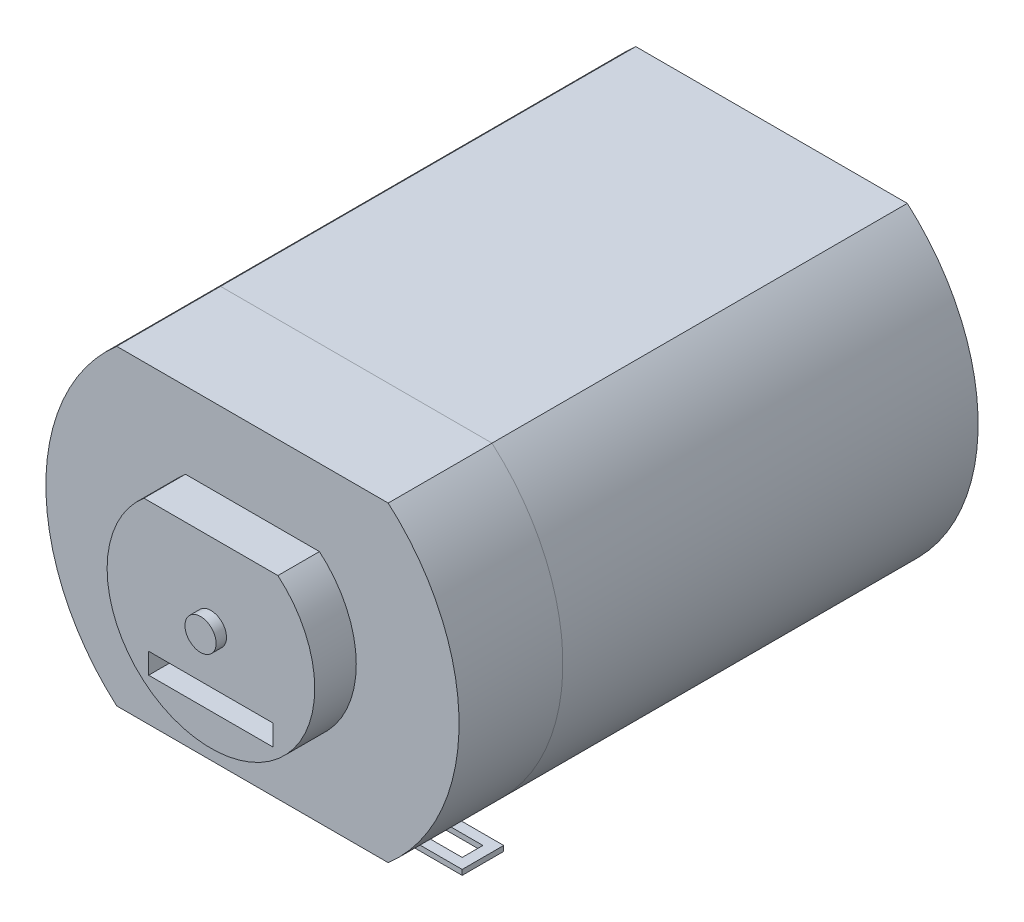
ISO-10303-21;
HEADER;
FILE_DESCRIPTION(('STEP AP214'),'2;1');
FILE_NAME('part.step','',(''),(''),'','','');
FILE_SCHEMA(('AUTOMOTIVE_DESIGN { 1 0 10303 214 1 1 1 1 }'));
ENDSEC;
DATA;
#1=APPLICATION_CONTEXT('core data for automotive mechanical design processes');
#2=APPLICATION_PROTOCOL_DEFINITION('international standard','automotive_design',2000,#1);
#3=PRODUCT_CONTEXT('',#1,'mechanical');
#4=PRODUCT('Part','Part','',(#3));
#5=PRODUCT_RELATED_PRODUCT_CATEGORY('part','',(#4));
#6=PRODUCT_DEFINITION_FORMATION('','',#4);
#7=PRODUCT_DEFINITION_CONTEXT('part definition',#1,'design');
#8=PRODUCT_DEFINITION('design','',#6,#7);
#9=PRODUCT_DEFINITION_SHAPE('','',#8);
#10=(LENGTH_UNIT() NAMED_UNIT(*) SI_UNIT(.MILLI.,.METRE.));
#11=(NAMED_UNIT(*) PLANE_ANGLE_UNIT() SI_UNIT($,.RADIAN.));
#12=(NAMED_UNIT(*) SI_UNIT($,.STERADIAN.) SOLID_ANGLE_UNIT());
#13=UNCERTAINTY_MEASURE_WITH_UNIT(LENGTH_MEASURE(1.E-05),#10,'distance_accuracy_value','');
#14=(GEOMETRIC_REPRESENTATION_CONTEXT(3) GLOBAL_UNCERTAINTY_ASSIGNED_CONTEXT((#13)) GLOBAL_UNIT_ASSIGNED_CONTEXT((#10,
#11,#12)) REPRESENTATION_CONTEXT('',''));
#15=CARTESIAN_POINT('',(0.,0.,0.));
#16=DIRECTION('',(0.,0.,1.));
#17=DIRECTION('',(1.,0.,0.));
#18=AXIS2_PLACEMENT_3D('',#15,#16,#17);
#19=CARTESIAN_POINT('',(0.,-0.77,25.27));
#20=DIRECTION('',(0.,0.,1.));
#21=DIRECTION('',(1.,0.,0.));
#22=AXIS2_PLACEMENT_3D('',#19,#20,#21);
#23=CYLINDRICAL_SURFACE('',#22,9.95);
#24=CARTESIAN_POINT('',(0.,-0.77,25.27));
#25=DIRECTION('',(0.,0.,1.));
#26=DIRECTION('',(1.,0.,0.));
#27=AXIS2_PLACEMENT_3D('',#24,#25,#26);
#28=CIRCLE('',#27,9.95);
#29=CARTESIAN_POINT('',(-6.53853959229429,6.73,25.27));
#30=VERTEX_POINT('',#29);
#31=CARTESIAN_POINT('',(-6.53853959229429,-8.27,25.27));
#32=VERTEX_POINT('',#31);
#33=EDGE_CURVE('P0_E69',#30,#32,#28,.T.);
#34=ORIENTED_EDGE('',*,*,#33,.T.);
#35=DIRECTION('',(0.,0.,1.));
#36=VECTOR('',#35,1.);
#37=CARTESIAN_POINT('',(-6.53853959229429,-8.27,25.27));
#38=LINE('',#37,#36);
#39=CARTESIAN_POINT('',(-6.53853959229429,-8.27,45.27));
#40=VERTEX_POINT('',#39);
#41=EDGE_CURVE('P0_E59',#40,#32,#38,.F.);
#42=ORIENTED_EDGE('',*,*,#41,.F.);
#43=CARTESIAN_POINT('',(0.,-0.77,45.27));
#44=DIRECTION('',(0.,0.,1.));
#45=DIRECTION('',(1.,0.,0.));
#46=AXIS2_PLACEMENT_3D('',#43,#44,#45);
#47=CIRCLE('',#46,9.95);
#48=CARTESIAN_POINT('',(-6.53853959229429,6.73,45.27));
#49=VERTEX_POINT('',#48);
#50=EDGE_CURVE('P0_E19',#49,#40,#47,.T.);
#51=ORIENTED_EDGE('',*,*,#50,.F.);
#52=DIRECTION('',(0.,0.,1.));
#53=VECTOR('',#52,1.);
#54=CARTESIAN_POINT('',(-6.53853959229429,6.73,25.27));
#55=LINE('',#54,#53);
#56=EDGE_CURVE('P0_E58',#30,#49,#55,.T.);
#57=ORIENTED_EDGE('',*,*,#56,.F.);
#58=EDGE_LOOP('',(#34,#42,#51,#57));
#59=FACE_BOUND('',#58,.T.);
#60=ADVANCED_FACE('P0_F16',(#59),#23,.T.);
#61=CARTESIAN_POINT('',(0.,-0.770000000000001,45.27));
#62=DIRECTION('',(0.,0.,1.));
#63=DIRECTION('',(1.,0.,0.));
#64=AXIS2_PLACEMENT_3D('',#61,#62,#63);
#65=PLANE('',#64);
#66=DIRECTION('',(1.,0.,0.));
#67=VECTOR('',#66,1.);
#68=CARTESIAN_POINT('',(-6.53853959229429,-8.27,45.27));
#69=LINE('',#68,#67);
#70=CARTESIAN_POINT('',(6.53853959229429,-8.27,45.27));
#71=VERTEX_POINT('',#70);
#72=EDGE_CURVE('P0_E62',#71,#40,#69,.F.);
#73=ORIENTED_EDGE('',*,*,#72,.F.);
#74=CARTESIAN_POINT('',(0.,-0.77,45.27));
#75=DIRECTION('',(0.,0.,1.));
#76=DIRECTION('',(1.,0.,0.));
#77=AXIS2_PLACEMENT_3D('',#74,#75,#76);
#78=CIRCLE('',#77,9.95);
#79=CARTESIAN_POINT('',(6.53853959229429,6.73,45.27));
#80=VERTEX_POINT('',#79);
#81=EDGE_CURVE('P0_E67',#80,#71,#78,.F.);
#82=ORIENTED_EDGE('',*,*,#81,.F.);
#83=DIRECTION('',(1.,0.,0.));
#84=VECTOR('',#83,1.);
#85=CARTESIAN_POINT('',(6.53853959229429,6.73,45.27));
#86=LINE('',#85,#84);
#87=EDGE_CURVE('P0_E64',#49,#80,#86,.T.);
#88=ORIENTED_EDGE('',*,*,#87,.F.);
#89=ORIENTED_EDGE('',*,*,#50,.T.);
#90=EDGE_LOOP('',(#73,#82,#88,#89));
#91=FACE_BOUND('',#90,.T.);
#92=ADVANCED_FACE('P0_F65',(#91),#65,.T.);
#93=CARTESIAN_POINT('',(-6.53853959229429,-8.27,25.27));
#94=DIRECTION('',(0.,-1.,0.));
#95=DIRECTION('',(1.,0.,0.));
#96=AXIS2_PLACEMENT_3D('',#93,#94,#95);
#97=PLANE('',#96);
#98=DIRECTION('',(1.,0.,0.));
#99=VECTOR('',#98,1.);
#100=CARTESIAN_POINT('',(0.,-8.27,25.27));
#101=LINE('',#100,#99);
#102=CARTESIAN_POINT('',(6.53853959229429,-8.27,25.27));
#103=VERTEX_POINT('',#102);
#104=EDGE_CURVE('P0_E79',#32,#103,#101,.T.);
#105=ORIENTED_EDGE('',*,*,#104,.T.);
#106=DIRECTION('',(0.,0.,1.));
#107=VECTOR('',#106,1.);
#108=CARTESIAN_POINT('',(6.53853959229429,-8.27,25.27));
#109=LINE('',#108,#107);
#110=EDGE_CURVE('P0_E73',#71,#103,#109,.F.);
#111=ORIENTED_EDGE('',*,*,#110,.F.);
#112=ORIENTED_EDGE('',*,*,#72,.T.);
#113=ORIENTED_EDGE('',*,*,#41,.T.);
#114=EDGE_LOOP('',(#105,#111,#112,#113));
#115=FACE_BOUND('',#114,.T.);
#116=ADVANCED_FACE('P0_F87',(#115),#97,.T.);
#117=CARTESIAN_POINT('',(0.,-0.770000000000001,25.27));
#118=DIRECTION('',(0.,0.,1.));
#119=DIRECTION('',(1.,0.,0.));
#120=AXIS2_PLACEMENT_3D('',#117,#118,#119);
#121=PLANE('',#120);
#122=DIRECTION('',(1.,0.,0.));
#123=VECTOR('',#122,1.);
#124=CARTESIAN_POINT('',(6.53853959229429,6.73,25.27));
#125=LINE('',#124,#123);
#126=CARTESIAN_POINT('',(6.53853959229429,6.73,25.27));
#127=VERTEX_POINT('',#126);
#128=EDGE_CURVE('P0_E34',#127,#30,#125,.F.);
#129=ORIENTED_EDGE('',*,*,#128,.F.);
#130=CARTESIAN_POINT('',(0.,-0.77,25.27));
#131=DIRECTION('',(0.,0.,1.));
#132=DIRECTION('',(1.,0.,0.));
#133=AXIS2_PLACEMENT_3D('',#130,#131,#132);
#134=CIRCLE('',#133,9.95);
#135=EDGE_CURVE('P0_E25',#103,#127,#134,.T.);
#136=ORIENTED_EDGE('',*,*,#135,.F.);
#137=ORIENTED_EDGE('',*,*,#104,.F.);
#138=ORIENTED_EDGE('',*,*,#33,.F.);
#139=EDGE_LOOP('',(#129,#136,#137,#138));
#140=FACE_BOUND('',#139,.T.);
#141=ADVANCED_FACE('P0_F90',(#140),#121,.F.);
#142=CARTESIAN_POINT('',(6.53853959229429,6.73,25.27));
#143=DIRECTION('',(0.,1.,0.));
#144=DIRECTION('',(0.,0.,1.));
#145=AXIS2_PLACEMENT_3D('',#142,#143,#144);
#146=PLANE('',#145);
#147=ORIENTED_EDGE('',*,*,#128,.T.);
#148=ORIENTED_EDGE('',*,*,#56,.T.);
#149=ORIENTED_EDGE('',*,*,#87,.T.);
#150=DIRECTION('',(0.,0.,1.));
#151=VECTOR('',#150,1.);
#152=CARTESIAN_POINT('',(6.53853959229429,6.73,25.27));
#153=LINE('',#152,#151);
#154=EDGE_CURVE('P0_E11',#127,#80,#153,.T.);
#155=ORIENTED_EDGE('',*,*,#154,.F.);
#156=EDGE_LOOP('',(#147,#148,#149,#155));
#157=FACE_BOUND('',#156,.T.);
#158=ADVANCED_FACE('P0_F71',(#157),#146,.T.);
#159=CARTESIAN_POINT('',(0.,-0.77,25.27));
#160=DIRECTION('',(0.,0.,1.));
#161=DIRECTION('',(1.,0.,0.));
#162=AXIS2_PLACEMENT_3D('',#159,#160,#161);
#163=CYLINDRICAL_SURFACE('',#162,9.95);
#164=ORIENTED_EDGE('',*,*,#135,.T.);
#165=ORIENTED_EDGE('',*,*,#154,.T.);
#166=ORIENTED_EDGE('',*,*,#81,.T.);
#167=ORIENTED_EDGE('',*,*,#110,.T.);
#168=EDGE_LOOP('',(#164,#165,#166,#167));
#169=FACE_BOUND('',#168,.T.);
#170=ADVANCED_FACE('P0_F89',(#169),#163,.T.);
#171=CLOSED_SHELL('',(#60,#92,#116,#141,#158,#170));
#172=MANIFOLD_SOLID_BREP('P0_B1',#171);
#173=CARTESIAN_POINT('',(0.,-8.27,47.77));
#174=DIRECTION('',(0.,-1.,0.));
#175=DIRECTION('',(1.,0.,0.));
#176=AXIS2_PLACEMENT_3D('',#173,#174,#175);
#177=PLANE('',#176);
#178=DIRECTION('',(0.,0.,1.));
#179=VECTOR('',#178,1.);
#180=CARTESIAN_POINT('',(-8.09999999999994,-8.27,47.77));
#181=LINE('',#180,#179);
#182=CARTESIAN_POINT('',(-8.09999999999994,-8.27,47.27));
#183=VERTEX_POINT('',#182);
#184=CARTESIAN_POINT('',(-8.09999999999994,-8.27,48.27));
#185=VERTEX_POINT('',#184);
#186=EDGE_CURVE('P1_E19',#183,#185,#181,.T.);
#187=ORIENTED_EDGE('',*,*,#186,.F.);
#188=DIRECTION('',(1.,0.,0.));
#189=VECTOR('',#188,1.);
#190=CARTESIAN_POINT('',(-6.09999999999995,-8.27,47.27));
#191=LINE('',#190,#189);
#192=CARTESIAN_POINT('',(-6.09999999999995,-8.27,47.27));
#193=VERTEX_POINT('',#192);
#194=EDGE_CURVE('P1_E168',#193,#183,#191,.F.);
#195=ORIENTED_EDGE('',*,*,#194,.F.);
#196=DIRECTION('',(0.,0.,1.));
#197=VECTOR('',#196,1.);
#198=CARTESIAN_POINT('',(-6.09999999999995,-8.27,48.27));
#199=LINE('',#198,#197);
#200=CARTESIAN_POINT('',(-6.09999999999995,-8.27,48.27));
#201=VERTEX_POINT('',#200);
#202=EDGE_CURVE('P1_E162',#201,#193,#199,.F.);
#203=ORIENTED_EDGE('',*,*,#202,.F.);
#204=DIRECTION('',(-1.,0.,0.));
#205=VECTOR('',#204,1.);
#206=CARTESIAN_POINT('',(-8.09999999999995,-8.27,48.27));
#207=LINE('',#206,#205);
#208=EDGE_CURVE('P1_E159',#185,#201,#207,.F.);
#209=ORIENTED_EDGE('',*,*,#208,.F.);
#210=EDGE_LOOP('',(#187,#195,#203,#209));
#211=FACE_BOUND('',#210,.T.);
#212=DIRECTION('',(-1.,0.,0.));
#213=VECTOR('',#212,1.);
#214=CARTESIAN_POINT('',(6.09999999999994,-8.27,48.27));
#215=LINE('',#214,#213);
#216=CARTESIAN_POINT('',(6.09999999999994,-8.27,48.27));
#217=VERTEX_POINT('',#216);
#218=CARTESIAN_POINT('',(8.09999999999995,-8.27,48.27));
#219=VERTEX_POINT('',#218);
#220=EDGE_CURVE('P1_E150',#217,#219,#215,.F.);
#221=ORIENTED_EDGE('',*,*,#220,.F.);
#222=DIRECTION('',(0.,0.,-1.));
#223=VECTOR('',#222,1.);
#224=CARTESIAN_POINT('',(6.09999999999994,-8.27,47.27));
#225=LINE('',#224,#223);
#226=CARTESIAN_POINT('',(6.09999999999994,-8.27,47.27));
#227=VERTEX_POINT('',#226);
#228=EDGE_CURVE('P1_E144',#227,#217,#225,.F.);
#229=ORIENTED_EDGE('',*,*,#228,.F.);
#230=DIRECTION('',(1.,0.,0.));
#231=VECTOR('',#230,1.);
#232=CARTESIAN_POINT('',(8.09999999999994,-8.27,47.27));
#233=LINE('',#232,#231);
#234=CARTESIAN_POINT('',(8.09999999999994,-8.27,47.27));
#235=VERTEX_POINT('',#234);
#236=EDGE_CURVE('P1_E138',#235,#227,#233,.F.);
#237=ORIENTED_EDGE('',*,*,#236,.F.);
#238=DIRECTION('',(0.,0.,1.));
#239=VECTOR('',#238,1.);
#240=CARTESIAN_POINT('',(8.09999999999995,-8.27,48.27));
#241=LINE('',#240,#239);
#242=EDGE_CURVE('P1_E135',#219,#235,#241,.F.);
#243=ORIENTED_EDGE('',*,*,#242,.F.);
#244=EDGE_LOOP('',(#221,#229,#237,#243));
#245=FACE_BOUND('',#244,.T.);
#246=DIRECTION('',(-1.,0.,0.));
#247=VECTOR('',#246,1.);
#248=CARTESIAN_POINT('',(-8.60000000000006,-8.27,46.77));
#249=LINE('',#248,#247);
#250=CARTESIAN_POINT('',(-8.60000000000006,-8.27,46.77));
#251=VERTEX_POINT('',#250);
#252=CARTESIAN_POINT('',(8.59999999999994,-8.27,46.77));
#253=VERTEX_POINT('',#252);
#254=EDGE_CURVE('P1_E129',#251,#253,#249,.F.);
#255=ORIENTED_EDGE('',*,*,#254,.F.);
#256=DIRECTION('',(0.,0.,1.));
#257=VECTOR('',#256,1.);
#258=CARTESIAN_POINT('',(-8.60000000000006,-8.27,48.77));
#259=LINE('',#258,#257);
#260=CARTESIAN_POINT('',(-8.60000000000006,-8.27,48.77));
#261=VERTEX_POINT('',#260);
#262=EDGE_CURVE('P1_E103',#261,#251,#259,.F.);
#263=ORIENTED_EDGE('',*,*,#262,.F.);
#264=DIRECTION('',(1.,0.,0.));
#265=VECTOR('',#264,1.);
#266=CARTESIAN_POINT('',(8.59999999999994,-8.27,48.77));
#267=LINE('',#266,#265);
#268=CARTESIAN_POINT('',(8.59999999999994,-8.27,48.77));
#269=VERTEX_POINT('',#268);
#270=EDGE_CURVE('P1_E105',#269,#261,#267,.F.);
#271=ORIENTED_EDGE('',*,*,#270,.F.);
#272=DIRECTION('',(0.,0.,-1.));
#273=VECTOR('',#272,1.);
#274=CARTESIAN_POINT('',(8.59999999999994,-8.27,46.77));
#275=LINE('',#274,#273);
#276=EDGE_CURVE('P1_E107',#253,#269,#275,.F.);
#277=ORIENTED_EDGE('',*,*,#276,.F.);
#278=EDGE_LOOP('',(#255,#263,#271,#277));
#279=FACE_BOUND('',#278,.T.);
#280=ADVANCED_FACE('P1_F16',(#211,#245,#279),#177,.F.);
#281=CARTESIAN_POINT('',(8.59999999999994,-8.27,46.77));
#282=DIRECTION('',(1.,0.,0.));
#283=DIRECTION('',(0.,0.,-1.));
#284=AXIS2_PLACEMENT_3D('',#281,#282,#283);
#285=PLANE('',#284);
#286=DIRECTION('',(0.,0.,-1.));
#287=VECTOR('',#286,1.);
#288=CARTESIAN_POINT('',(8.59999999999994,-8.52,47.77));
#289=LINE('',#288,#287);
#290=CARTESIAN_POINT('',(8.59999999999994,-8.52,46.77));
#291=VERTEX_POINT('',#290);
#292=CARTESIAN_POINT('',(8.59999999999994,-8.52,48.77));
#293=VERTEX_POINT('',#292);
#294=EDGE_CURVE('P1_E177',#291,#293,#289,.F.);
#295=ORIENTED_EDGE('',*,*,#294,.F.);
#296=DIRECTION('',(0.,1.,0.));
#297=VECTOR('',#296,1.);
#298=CARTESIAN_POINT('',(8.59999999999994,-8.27,46.77));
#299=LINE('',#298,#297);
#300=EDGE_CURVE('P1_E118',#253,#291,#299,.F.);
#301=ORIENTED_EDGE('',*,*,#300,.F.);
#302=ORIENTED_EDGE('',*,*,#276,.T.);
#303=DIRECTION('',(0.,1.,0.));
#304=VECTOR('',#303,1.);
#305=CARTESIAN_POINT('',(8.59999999999994,-8.27,48.77));
#306=LINE('',#305,#304);
#307=EDGE_CURVE('P1_E112',#293,#269,#306,.T.);
#308=ORIENTED_EDGE('',*,*,#307,.F.);
#309=EDGE_LOOP('',(#295,#301,#302,#308));
#310=FACE_BOUND('',#309,.T.);
#311=ADVANCED_FACE('P1_F115',(#310),#285,.T.);
#312=CARTESIAN_POINT('',(8.59999999999994,-8.27,48.77));
#313=DIRECTION('',(0.,0.,1.));
#314=DIRECTION('',(1.,0.,0.));
#315=AXIS2_PLACEMENT_3D('',#312,#313,#314);
#316=PLANE('',#315);
#317=DIRECTION('',(1.,0.,0.));
#318=VECTOR('',#317,1.);
#319=CARTESIAN_POINT('',(0.,-8.52,48.77));
#320=LINE('',#319,#318);
#321=CARTESIAN_POINT('',(-8.60000000000006,-8.52,48.77));
#322=VERTEX_POINT('',#321);
#323=EDGE_CURVE('P1_E122',#293,#322,#320,.F.);
#324=ORIENTED_EDGE('',*,*,#323,.F.);
#325=ORIENTED_EDGE('',*,*,#307,.T.);
#326=ORIENTED_EDGE('',*,*,#270,.T.);
#327=DIRECTION('',(0.,1.,0.));
#328=VECTOR('',#327,1.);
#329=CARTESIAN_POINT('',(-8.60000000000006,-8.27,48.77));
#330=LINE('',#329,#328);
#331=EDGE_CURVE('P1_E125',#322,#261,#330,.T.);
#332=ORIENTED_EDGE('',*,*,#331,.F.);
#333=EDGE_LOOP('',(#324,#325,#326,#332));
#334=FACE_BOUND('',#333,.T.);
#335=ADVANCED_FACE('P1_F120',(#334),#316,.T.);
#336=CARTESIAN_POINT('',(-8.60000000000006,-8.27,48.77));
#337=DIRECTION('',(-1.,0.,0.));
#338=DIRECTION('',(0.,0.,1.));
#339=AXIS2_PLACEMENT_3D('',#336,#337,#338);
#340=PLANE('',#339);
#341=DIRECTION('',(0.,0.,-1.));
#342=VECTOR('',#341,1.);
#343=CARTESIAN_POINT('',(-8.60000000000006,-8.52,47.77));
#344=LINE('',#343,#342);
#345=CARTESIAN_POINT('',(-8.60000000000006,-8.52,46.77));
#346=VERTEX_POINT('',#345);
#347=EDGE_CURVE('P1_E180',#322,#346,#344,.T.);
#348=ORIENTED_EDGE('',*,*,#347,.F.);
#349=ORIENTED_EDGE('',*,*,#331,.T.);
#350=ORIENTED_EDGE('',*,*,#262,.T.);
#351=DIRECTION('',(0.,1.,0.));
#352=VECTOR('',#351,1.);
#353=CARTESIAN_POINT('',(-8.60000000000006,-8.27,46.77));
#354=LINE('',#353,#352);
#355=EDGE_CURVE('P1_E132',#346,#251,#354,.T.);
#356=ORIENTED_EDGE('',*,*,#355,.F.);
#357=EDGE_LOOP('',(#348,#349,#350,#356));
#358=FACE_BOUND('',#357,.T.);
#359=ADVANCED_FACE('P1_F253',(#358),#340,.T.);
#360=CARTESIAN_POINT('',(-8.60000000000006,-8.27,46.77));
#361=DIRECTION('',(0.,0.,-1.));
#362=DIRECTION('',(-1.,0.,0.));
#363=AXIS2_PLACEMENT_3D('',#360,#361,#362);
#364=PLANE('',#363);
#365=DIRECTION('',(1.,0.,0.));
#366=VECTOR('',#365,1.);
#367=CARTESIAN_POINT('',(0.,-8.52,46.77));
#368=LINE('',#367,#366);
#369=EDGE_CURVE('P1_E183',#346,#291,#368,.T.);
#370=ORIENTED_EDGE('',*,*,#369,.F.);
#371=ORIENTED_EDGE('',*,*,#355,.T.);
#372=ORIENTED_EDGE('',*,*,#254,.T.);
#373=ORIENTED_EDGE('',*,*,#300,.T.);
#374=EDGE_LOOP('',(#370,#371,#372,#373));
#375=FACE_BOUND('',#374,.T.);
#376=ADVANCED_FACE('P1_F249',(#375),#364,.T.);
#377=CARTESIAN_POINT('',(8.09999999999995,-8.27,48.27));
#378=DIRECTION('',(-1.,0.,0.));
#379=DIRECTION('',(0.,0.,1.));
#380=AXIS2_PLACEMENT_3D('',#377,#378,#379);
#381=PLANE('',#380);
#382=DIRECTION('',(0.,0.,-1.));
#383=VECTOR('',#382,1.);
#384=CARTESIAN_POINT('',(8.09999999999995,-8.52,47.77));
#385=LINE('',#384,#383);
#386=CARTESIAN_POINT('',(8.09999999999995,-8.52,48.27));
#387=VERTEX_POINT('',#386);
#388=CARTESIAN_POINT('',(8.09999999999994,-8.52,47.27));
#389=VERTEX_POINT('',#388);
#390=EDGE_CURVE('P1_E186',#387,#389,#385,.T.);
#391=ORIENTED_EDGE('',*,*,#390,.F.);
#392=DIRECTION('',(0.,1.,0.));
#393=VECTOR('',#392,1.);
#394=CARTESIAN_POINT('',(8.09999999999995,-8.27,48.27));
#395=LINE('',#394,#393);
#396=EDGE_CURVE('P1_E153',#219,#387,#395,.F.);
#397=ORIENTED_EDGE('',*,*,#396,.F.);
#398=ORIENTED_EDGE('',*,*,#242,.T.);
#399=DIRECTION('',(0.,1.,0.));
#400=VECTOR('',#399,1.);
#401=CARTESIAN_POINT('',(8.09999999999994,-8.27,47.27));
#402=LINE('',#401,#400);
#403=EDGE_CURVE('P1_E141',#389,#235,#402,.T.);
#404=ORIENTED_EDGE('',*,*,#403,.F.);
#405=EDGE_LOOP('',(#391,#397,#398,#404));
#406=FACE_BOUND('',#405,.T.);
#407=ADVANCED_FACE('P1_F245',(#406),#381,.T.);
#408=CARTESIAN_POINT('',(8.09999999999994,-8.27,47.27));
#409=DIRECTION('',(0.,0.,1.));
#410=DIRECTION('',(1.,0.,0.));
#411=AXIS2_PLACEMENT_3D('',#408,#409,#410);
#412=PLANE('',#411);
#413=DIRECTION('',(1.,0.,0.));
#414=VECTOR('',#413,1.);
#415=CARTESIAN_POINT('',(0.,-8.52,47.27));
#416=LINE('',#415,#414);
#417=CARTESIAN_POINT('',(6.09999999999994,-8.52,47.27));
#418=VERTEX_POINT('',#417);
#419=EDGE_CURVE('P1_E189',#389,#418,#416,.F.);
#420=ORIENTED_EDGE('',*,*,#419,.F.);
#421=ORIENTED_EDGE('',*,*,#403,.T.);
#422=ORIENTED_EDGE('',*,*,#236,.T.);
#423=DIRECTION('',(0.,1.,0.));
#424=VECTOR('',#423,1.);
#425=CARTESIAN_POINT('',(6.09999999999994,-8.27,47.27));
#426=LINE('',#425,#424);
#427=EDGE_CURVE('P1_E147',#418,#227,#426,.T.);
#428=ORIENTED_EDGE('',*,*,#427,.F.);
#429=EDGE_LOOP('',(#420,#421,#422,#428));
#430=FACE_BOUND('',#429,.T.);
#431=ADVANCED_FACE('P1_F241',(#430),#412,.T.);
#432=CARTESIAN_POINT('',(6.09999999999994,-8.27,47.27));
#433=DIRECTION('',(1.,0.,0.));
#434=DIRECTION('',(0.,0.,-1.));
#435=AXIS2_PLACEMENT_3D('',#432,#433,#434);
#436=PLANE('',#435);
#437=DIRECTION('',(0.,0.,-1.));
#438=VECTOR('',#437,1.);
#439=CARTESIAN_POINT('',(6.09999999999994,-8.52,47.77));
#440=LINE('',#439,#438);
#441=CARTESIAN_POINT('',(6.09999999999994,-8.52,48.27));
#442=VERTEX_POINT('',#441);
#443=EDGE_CURVE('P1_E192',#418,#442,#440,.F.);
#444=ORIENTED_EDGE('',*,*,#443,.F.);
#445=ORIENTED_EDGE('',*,*,#427,.T.);
#446=ORIENTED_EDGE('',*,*,#228,.T.);
#447=DIRECTION('',(0.,1.,0.));
#448=VECTOR('',#447,1.);
#449=CARTESIAN_POINT('',(6.09999999999994,-8.27,48.27));
#450=LINE('',#449,#448);
#451=EDGE_CURVE('P1_E156',#442,#217,#450,.T.);
#452=ORIENTED_EDGE('',*,*,#451,.F.);
#453=EDGE_LOOP('',(#444,#445,#446,#452));
#454=FACE_BOUND('',#453,.T.);
#455=ADVANCED_FACE('P1_F237',(#454),#436,.T.);
#456=CARTESIAN_POINT('',(6.09999999999994,-8.27,48.27));
#457=DIRECTION('',(0.,0.,-1.));
#458=DIRECTION('',(-1.,0.,0.));
#459=AXIS2_PLACEMENT_3D('',#456,#457,#458);
#460=PLANE('',#459);
#461=DIRECTION('',(1.,0.,0.));
#462=VECTOR('',#461,1.);
#463=CARTESIAN_POINT('',(0.,-8.52,48.27));
#464=LINE('',#463,#462);
#465=EDGE_CURVE('P1_E195',#442,#387,#464,.T.);
#466=ORIENTED_EDGE('',*,*,#465,.F.);
#467=ORIENTED_EDGE('',*,*,#451,.T.);
#468=ORIENTED_EDGE('',*,*,#220,.T.);
#469=ORIENTED_EDGE('',*,*,#396,.T.);
#470=EDGE_LOOP('',(#466,#467,#468,#469));
#471=FACE_BOUND('',#470,.T.);
#472=ADVANCED_FACE('P1_F234',(#471),#460,.T.);
#473=CARTESIAN_POINT('',(-8.09999999999995,-8.27,48.27));
#474=DIRECTION('',(0.,0.,-1.));
#475=DIRECTION('',(-1.,0.,0.));
#476=AXIS2_PLACEMENT_3D('',#473,#474,#475);
#477=PLANE('',#476);
#478=DIRECTION('',(1.,0.,0.));
#479=VECTOR('',#478,1.);
#480=CARTESIAN_POINT('',(0.,-8.52,48.27));
#481=LINE('',#480,#479);
#482=CARTESIAN_POINT('',(-8.09999999999995,-8.52,48.27));
#483=VERTEX_POINT('',#482);
#484=CARTESIAN_POINT('',(-6.09999999999995,-8.52,48.27));
#485=VERTEX_POINT('',#484);
#486=EDGE_CURVE('P1_E198',#483,#485,#481,.T.);
#487=ORIENTED_EDGE('',*,*,#486,.F.);
#488=DIRECTION('',(0.,1.,0.));
#489=VECTOR('',#488,1.);
#490=CARTESIAN_POINT('',(-8.09999999999995,-8.27,48.27));
#491=LINE('',#490,#489);
#492=EDGE_CURVE('P1_E173',#185,#483,#491,.F.);
#493=ORIENTED_EDGE('',*,*,#492,.F.);
#494=ORIENTED_EDGE('',*,*,#208,.T.);
#495=DIRECTION('',(0.,1.,0.));
#496=VECTOR('',#495,1.);
#497=CARTESIAN_POINT('',(-6.09999999999995,-8.27,48.27));
#498=LINE('',#497,#496);
#499=EDGE_CURVE('P1_E165',#485,#201,#498,.T.);
#500=ORIENTED_EDGE('',*,*,#499,.F.);
#501=EDGE_LOOP('',(#487,#493,#494,#500));
#502=FACE_BOUND('',#501,.T.);
#503=ADVANCED_FACE('P1_F217',(#502),#477,.T.);
#504=CARTESIAN_POINT('',(-6.09999999999995,-8.27,48.27));
#505=DIRECTION('',(-1.,0.,0.));
#506=DIRECTION('',(0.,0.,1.));
#507=AXIS2_PLACEMENT_3D('',#504,#505,#506);
#508=PLANE('',#507);
#509=DIRECTION('',(0.,0.,-1.));
#510=VECTOR('',#509,1.);
#511=CARTESIAN_POINT('',(-6.09999999999995,-8.52,47.77));
#512=LINE('',#511,#510);
#513=CARTESIAN_POINT('',(-6.09999999999995,-8.52,47.27));
#514=VERTEX_POINT('',#513);
#515=EDGE_CURVE('P1_E201',#485,#514,#512,.T.);
#516=ORIENTED_EDGE('',*,*,#515,.F.);
#517=ORIENTED_EDGE('',*,*,#499,.T.);
#518=ORIENTED_EDGE('',*,*,#202,.T.);
#519=DIRECTION('',(0.,1.,0.));
#520=VECTOR('',#519,1.);
#521=CARTESIAN_POINT('',(-6.09999999999995,-8.27,47.27));
#522=LINE('',#521,#520);
#523=EDGE_CURVE('P1_E170',#514,#193,#522,.T.);
#524=ORIENTED_EDGE('',*,*,#523,.F.);
#525=EDGE_LOOP('',(#516,#517,#518,#524));
#526=FACE_BOUND('',#525,.T.);
#527=ADVANCED_FACE('P1_F211',(#526),#508,.T.);
#528=CARTESIAN_POINT('',(-6.09999999999995,-8.27,47.27));
#529=DIRECTION('',(0.,0.,1.));
#530=DIRECTION('',(1.,0.,0.));
#531=AXIS2_PLACEMENT_3D('',#528,#529,#530);
#532=PLANE('',#531);
#533=DIRECTION('',(1.,0.,0.));
#534=VECTOR('',#533,1.);
#535=CARTESIAN_POINT('',(0.,-8.52,47.27));
#536=LINE('',#535,#534);
#537=CARTESIAN_POINT('',(-8.09999999999994,-8.52,47.27));
#538=VERTEX_POINT('',#537);
#539=EDGE_CURVE('P1_E25',#514,#538,#536,.F.);
#540=ORIENTED_EDGE('',*,*,#539,.F.);
#541=ORIENTED_EDGE('',*,*,#523,.T.);
#542=ORIENTED_EDGE('',*,*,#194,.T.);
#543=DIRECTION('',(0.,1.,0.));
#544=VECTOR('',#543,1.);
#545=CARTESIAN_POINT('',(-8.09999999999994,-8.27,47.27));
#546=LINE('',#545,#544);
#547=EDGE_CURVE('P1_E34',#538,#183,#546,.T.);
#548=ORIENTED_EDGE('',*,*,#547,.F.);
#549=EDGE_LOOP('',(#540,#541,#542,#548));
#550=FACE_BOUND('',#549,.T.);
#551=ADVANCED_FACE('P1_F209',(#550),#532,.T.);
#552=CARTESIAN_POINT('',(-8.09999999999994,-8.27,47.27));
#553=DIRECTION('',(1.,0.,0.));
#554=DIRECTION('',(0.,0.,-1.));
#555=AXIS2_PLACEMENT_3D('',#552,#553,#554);
#556=PLANE('',#555);
#557=DIRECTION('',(0.,0.,-1.));
#558=VECTOR('',#557,1.);
#559=CARTESIAN_POINT('',(-8.09999999999994,-8.52,47.77));
#560=LINE('',#559,#558);
#561=EDGE_CURVE('P1_E11',#538,#483,#560,.F.);
#562=ORIENTED_EDGE('',*,*,#561,.F.);
#563=ORIENTED_EDGE('',*,*,#547,.T.);
#564=ORIENTED_EDGE('',*,*,#186,.T.);
#565=ORIENTED_EDGE('',*,*,#492,.T.);
#566=EDGE_LOOP('',(#562,#563,#564,#565));
#567=FACE_BOUND('',#566,.T.);
#568=ADVANCED_FACE('P1_F219',(#567),#556,.T.);
#569=CARTESIAN_POINT('',(0.,-8.52,47.77));
#570=DIRECTION('',(0.,-1.,0.));
#571=DIRECTION('',(0.,0.,-1.));
#572=AXIS2_PLACEMENT_3D('',#569,#570,#571);
#573=PLANE('',#572);
#574=ORIENTED_EDGE('',*,*,#539,.T.);
#575=ORIENTED_EDGE('',*,*,#561,.T.);
#576=ORIENTED_EDGE('',*,*,#486,.T.);
#577=ORIENTED_EDGE('',*,*,#515,.T.);
#578=EDGE_LOOP('',(#574,#575,#576,#577));
#579=FACE_BOUND('',#578,.T.);
#580=ORIENTED_EDGE('',*,*,#443,.T.);
#581=ORIENTED_EDGE('',*,*,#465,.T.);
#582=ORIENTED_EDGE('',*,*,#390,.T.);
#583=ORIENTED_EDGE('',*,*,#419,.T.);
#584=EDGE_LOOP('',(#580,#581,#582,#583));
#585=FACE_BOUND('',#584,.T.);
#586=ORIENTED_EDGE('',*,*,#347,.T.);
#587=ORIENTED_EDGE('',*,*,#369,.T.);
#588=ORIENTED_EDGE('',*,*,#294,.T.);
#589=ORIENTED_EDGE('',*,*,#323,.T.);
#590=EDGE_LOOP('',(#586,#587,#588,#589));
#591=FACE_BOUND('',#590,.T.);
#592=ADVANCED_FACE('P1_F206',(#579,#585,#591),#573,.T.);
#593=CLOSED_SHELL('',(#280,#311,#335,#359,#376,#407,#431,#455,#472,#503,#527,#551,#568,#592));
#594=MANIFOLD_SOLID_BREP('P1_B1',#593);
#595=CARTESIAN_POINT('',(0.,-0.770000000000001,50.27));
#596=DIRECTION('',(0.,0.,1.));
#597=DIRECTION('',(1.,0.,0.));
#598=AXIS2_PLACEMENT_3D('',#595,#596,#597);
#599=PLANE('',#598);
#600=CARTESIAN_POINT('',(0.,-0.77,50.27));
#601=DIRECTION('',(0.,0.,1.));
#602=DIRECTION('',(1.,0.,0.));
#603=AXIS2_PLACEMENT_3D('',#600,#601,#602);
#604=CIRCLE('',#603,0.75);
#605=CARTESIAN_POINT('',(0.75,-0.77,50.27));
#606=VERTEX_POINT('',#605);
#607=EDGE_CURVE('P2_E19',#606,#606,#604,.T.);
#608=ORIENTED_EDGE('',*,*,#607,.T.);
#609=EDGE_LOOP('',(#608));
#610=FACE_BOUND('',#609,.T.);
#611=ADVANCED_FACE('P2_F16',(#610),#599,.T.);
#612=CARTESIAN_POINT('',(0.,-0.770000000000001,50.27));
#613=DIRECTION('',(0.,0.,1.));
#614=DIRECTION('',(1.,0.,0.));
#615=AXIS2_PLACEMENT_3D('',#612,#613,#614);
#616=PLANE('',#615);
#617=DIRECTION('',(1.,0.,0.));
#618=VECTOR('',#617,1.);
#619=CARTESIAN_POINT('',(3.,-4.22,50.27));
#620=LINE('',#619,#618);
#621=CARTESIAN_POINT('',(3.,-4.22,50.27));
#622=VERTEX_POINT('',#621);
#623=CARTESIAN_POINT('',(-3.,-4.22,50.27));
#624=VERTEX_POINT('',#623);
#625=EDGE_CURVE('P2_E102',#622,#624,#620,.F.);
#626=ORIENTED_EDGE('',*,*,#625,.F.);
#627=DIRECTION('',(0.,1.,0.));
#628=VECTOR('',#627,1.);
#629=CARTESIAN_POINT('',(3.,-3.22,50.27));
#630=LINE('',#629,#628);
#631=CARTESIAN_POINT('',(3.,-3.22,50.27));
#632=VERTEX_POINT('',#631);
#633=EDGE_CURVE('P2_E128',#632,#622,#630,.F.);
#634=ORIENTED_EDGE('',*,*,#633,.F.);
#635=DIRECTION('',(1.,0.,0.));
#636=VECTOR('',#635,1.);
#637=CARTESIAN_POINT('',(-3.,-3.22,50.27));
#638=LINE('',#637,#636);
#639=CARTESIAN_POINT('',(-3.,-3.22,50.27));
#640=VERTEX_POINT('',#639);
#641=EDGE_CURVE('P2_E116',#640,#632,#638,.T.);
#642=ORIENTED_EDGE('',*,*,#641,.F.);
#643=DIRECTION('',(0.,1.,0.));
#644=VECTOR('',#643,1.);
#645=CARTESIAN_POINT('',(-3.,-4.22,50.27));
#646=LINE('',#645,#644);
#647=EDGE_CURVE('P2_E114',#624,#640,#646,.T.);
#648=ORIENTED_EDGE('',*,*,#647,.F.);
#649=EDGE_LOOP('',(#626,#634,#642,#648));
#650=FACE_BOUND('',#649,.T.);
#651=ADVANCED_FACE('P2_F115',(#650),#616,.T.);
#652=CARTESIAN_POINT('',(3.,-3.22,50.27));
#653=DIRECTION('',(-1.,0.,0.));
#654=DIRECTION('',(0.,0.,1.));
#655=AXIS2_PLACEMENT_3D('',#652,#653,#654);
#656=PLANE('',#655);
#657=DIRECTION('',(0.,1.,0.));
#658=VECTOR('',#657,1.);
#659=CARTESIAN_POINT('',(3.,-3.22,52.27));
#660=LINE('',#659,#658);
#661=CARTESIAN_POINT('',(3.,-4.22,52.27));
#662=VERTEX_POINT('',#661);
#663=CARTESIAN_POINT('',(3.,-3.22,52.27));
#664=VERTEX_POINT('',#663);
#665=EDGE_CURVE('P2_E119',#662,#664,#660,.T.);
#666=ORIENTED_EDGE('',*,*,#665,.T.);
#667=DIRECTION('',(0.,0.,-1.));
#668=VECTOR('',#667,1.);
#669=CARTESIAN_POINT('',(3.,-3.22,50.27));
#670=LINE('',#669,#668);
#671=EDGE_CURVE('P2_E158',#632,#664,#670,.F.);
#672=ORIENTED_EDGE('',*,*,#671,.F.);
#673=ORIENTED_EDGE('',*,*,#633,.T.);
#674=DIRECTION('',(0.,0.,1.));
#675=VECTOR('',#674,1.);
#676=CARTESIAN_POINT('',(3.,-4.22,50.27));
#677=LINE('',#676,#675);
#678=EDGE_CURVE('P2_E109',#662,#622,#677,.F.);
#679=ORIENTED_EDGE('',*,*,#678,.F.);
#680=EDGE_LOOP('',(#666,#672,#673,#679));
#681=FACE_BOUND('',#680,.T.);
#682=ADVANCED_FACE('P2_F168',(#681),#656,.T.);
#683=CARTESIAN_POINT('',(-3.,-4.22,50.27));
#684=DIRECTION('',(1.,0.,0.));
#685=DIRECTION('',(0.,0.,-1.));
#686=AXIS2_PLACEMENT_3D('',#683,#684,#685);
#687=PLANE('',#686);
#688=DIRECTION('',(0.,1.,0.));
#689=VECTOR('',#688,1.);
#690=CARTESIAN_POINT('',(-3.,-4.22,52.27));
#691=LINE('',#690,#689);
#692=CARTESIAN_POINT('',(-3.,-3.22,52.27));
#693=VERTEX_POINT('',#692);
#694=CARTESIAN_POINT('',(-3.,-4.22,52.27));
#695=VERTEX_POINT('',#694);
#696=EDGE_CURVE('P2_E78',#693,#695,#691,.F.);
#697=ORIENTED_EDGE('',*,*,#696,.T.);
#698=DIRECTION('',(0.,0.,1.));
#699=VECTOR('',#698,1.);
#700=CARTESIAN_POINT('',(-3.,-4.22,50.27));
#701=LINE('',#700,#699);
#702=EDGE_CURVE('P2_E107',#624,#695,#701,.T.);
#703=ORIENTED_EDGE('',*,*,#702,.F.);
#704=ORIENTED_EDGE('',*,*,#647,.T.);
#705=DIRECTION('',(0.,0.,-1.));
#706=VECTOR('',#705,1.);
#707=CARTESIAN_POINT('',(-3.,-3.22,50.27));
#708=LINE('',#707,#706);
#709=EDGE_CURVE('P2_E153',#693,#640,#708,.T.);
#710=ORIENTED_EDGE('',*,*,#709,.F.);
#711=EDGE_LOOP('',(#697,#703,#704,#710));
#712=FACE_BOUND('',#711,.T.);
#713=ADVANCED_FACE('P2_F121',(#712),#687,.T.);
#714=CARTESIAN_POINT('',(0.,-0.77,50.27));
#715=DIRECTION('',(0.,0.,1.));
#716=DIRECTION('',(1.,0.,0.));
#717=AXIS2_PLACEMENT_3D('',#714,#715,#716);
#718=CYLINDRICAL_SURFACE('',#717,0.75);
#719=ORIENTED_EDGE('',*,*,#607,.F.);
#720=EDGE_LOOP('',(#719));
#721=FACE_BOUND('',#720,.T.);
#722=CARTESIAN_POINT('',(0.,-0.77,52.27));
#723=DIRECTION('',(0.,0.,1.));
#724=DIRECTION('',(1.,0.,0.));
#725=AXIS2_PLACEMENT_3D('',#722,#723,#724);
#726=CIRCLE('',#725,0.75);
#727=CARTESIAN_POINT('',(0.75,-0.77,52.27));
#728=VERTEX_POINT('',#727);
#729=EDGE_CURVE('P2_E150',#728,#728,#726,.F.);
#730=ORIENTED_EDGE('',*,*,#729,.F.);
#731=EDGE_LOOP('',(#730));
#732=FACE_BOUND('',#731,.T.);
#733=ADVANCED_FACE('P2_F299',(#721,#732),#718,.F.);
#734=CARTESIAN_POINT('',(3.,-4.22,50.27));
#735=DIRECTION('',(0.,1.,0.));
#736=DIRECTION('',(0.,0.,1.));
#737=AXIS2_PLACEMENT_3D('',#734,#735,#736);
#738=PLANE('',#737);
#739=DIRECTION('',(1.,0.,0.));
#740=VECTOR('',#739,1.);
#741=CARTESIAN_POINT('',(0.,-4.22,52.27));
#742=LINE('',#741,#740);
#743=EDGE_CURVE('P2_E152',#662,#695,#742,.F.);
#744=ORIENTED_EDGE('',*,*,#743,.F.);
#745=ORIENTED_EDGE('',*,*,#678,.T.);
#746=ORIENTED_EDGE('',*,*,#625,.T.);
#747=ORIENTED_EDGE('',*,*,#702,.T.);
#748=EDGE_LOOP('',(#744,#745,#746,#747));
#749=FACE_BOUND('',#748,.T.);
#750=ADVANCED_FACE('P2_F105',(#749),#738,.T.);
#751=CARTESIAN_POINT('',(-3.,-3.22,50.27));
#752=DIRECTION('',(0.,-1.,0.));
#753=DIRECTION('',(0.,0.,-1.));
#754=AXIS2_PLACEMENT_3D('',#751,#752,#753);
#755=PLANE('',#754);
#756=DIRECTION('',(1.,0.,0.));
#757=VECTOR('',#756,1.);
#758=CARTESIAN_POINT('',(0.,-3.22,52.27));
#759=LINE('',#758,#757);
#760=EDGE_CURVE('P2_E156',#693,#664,#759,.T.);
#761=ORIENTED_EDGE('',*,*,#760,.F.);
#762=ORIENTED_EDGE('',*,*,#709,.T.);
#763=ORIENTED_EDGE('',*,*,#641,.T.);
#764=ORIENTED_EDGE('',*,*,#671,.T.);
#765=EDGE_LOOP('',(#761,#762,#763,#764));
#766=FACE_BOUND('',#765,.T.);
#767=ADVANCED_FACE('P2_F165',(#766),#755,.T.);
#768=CARTESIAN_POINT('',(0.,-1.36,52.27));
#769=DIRECTION('',(0.,0.,1.));
#770=DIRECTION('',(1.,0.,0.));
#771=AXIS2_PLACEMENT_3D('',#768,#769,#770);
#772=PLANE('',#771);
#773=ORIENTED_EDGE('',*,*,#696,.F.);
#774=ORIENTED_EDGE('',*,*,#760,.T.);
#775=ORIENTED_EDGE('',*,*,#665,.F.);
#776=ORIENTED_EDGE('',*,*,#743,.T.);
#777=EDGE_LOOP('',(#773,#774,#775,#776));
#778=FACE_BOUND('',#777,.T.);
#779=ORIENTED_EDGE('',*,*,#729,.T.);
#780=EDGE_LOOP('',(#779));
#781=FACE_BOUND('',#780,.T.);
#782=CARTESIAN_POINT('',(0.,-0.77,52.27));
#783=DIRECTION('',(0.,0.,1.));
#784=DIRECTION('',(1.,0.,0.));
#785=AXIS2_PLACEMENT_3D('',#782,#783,#784);
#786=CIRCLE('',#785,5.);
#787=CARTESIAN_POINT('',(3.22608121410481,3.05,52.27));
#788=VERTEX_POINT('',#787);
#789=CARTESIAN_POINT('',(-3.22608121410481,3.05,52.27));
#790=VERTEX_POINT('',#789);
#791=EDGE_CURVE('P2_E147',#788,#790,#786,.F.);
#792=ORIENTED_EDGE('',*,*,#791,.F.);
#793=DIRECTION('',(1.,0.,0.));
#794=VECTOR('',#793,1.);
#795=CARTESIAN_POINT('',(3.22608121410481,3.05,52.27));
#796=LINE('',#795,#794);
#797=EDGE_CURVE('P2_E68',#790,#788,#796,.T.);
#798=ORIENTED_EDGE('',*,*,#797,.F.);
#799=EDGE_LOOP('',(#792,#798));
#800=FACE_BOUND('',#799,.T.);
#801=ADVANCED_FACE('P2_F169',(#778,#781,#800),#772,.T.);
#802=CARTESIAN_POINT('',(3.22608121410481,3.05,50.27));
#803=DIRECTION('',(0.,1.,0.));
#804=DIRECTION('',(0.,0.,1.));
#805=AXIS2_PLACEMENT_3D('',#802,#803,#804);
#806=PLANE('',#805);
#807=ORIENTED_EDGE('',*,*,#797,.T.);
#808=DIRECTION('',(0.,0.,1.));
#809=VECTOR('',#808,1.);
#810=CARTESIAN_POINT('',(3.22608121410481,3.05,50.27));
#811=LINE('',#810,#809);
#812=CARTESIAN_POINT('',(3.22608121410481,3.05,50.27));
#813=VERTEX_POINT('',#812);
#814=EDGE_CURVE('P2_E149',#813,#788,#811,.T.);
#815=ORIENTED_EDGE('',*,*,#814,.F.);
#816=DIRECTION('',(1.,0.,0.));
#817=VECTOR('',#816,1.);
#818=CARTESIAN_POINT('',(0.,3.05,50.27));
#819=LINE('',#818,#817);
#820=CARTESIAN_POINT('',(-3.22608121410481,3.05,50.27));
#821=VERTEX_POINT('',#820);
#822=EDGE_CURVE('P2_E146',#821,#813,#819,.T.);
#823=ORIENTED_EDGE('',*,*,#822,.F.);
#824=DIRECTION('',(0.,0.,1.));
#825=VECTOR('',#824,1.);
#826=CARTESIAN_POINT('',(-3.22608121410481,3.05,50.27));
#827=LINE('',#826,#825);
#828=EDGE_CURVE('P2_E148',#790,#821,#827,.F.);
#829=ORIENTED_EDGE('',*,*,#828,.F.);
#830=EDGE_LOOP('',(#807,#815,#823,#829));
#831=FACE_BOUND('',#830,.T.);
#832=ADVANCED_FACE('P2_F215',(#831),#806,.T.);
#833=CARTESIAN_POINT('',(0.,-0.77,50.27));
#834=DIRECTION('',(0.,0.,1.));
#835=DIRECTION('',(1.,0.,0.));
#836=AXIS2_PLACEMENT_3D('',#833,#834,#835);
#837=CYLINDRICAL_SURFACE('',#836,5.);
#838=ORIENTED_EDGE('',*,*,#791,.T.);
#839=ORIENTED_EDGE('',*,*,#828,.T.);
#840=CARTESIAN_POINT('',(0.,-0.77,50.27));
#841=DIRECTION('',(0.,0.,1.));
#842=DIRECTION('',(1.,0.,0.));
#843=AXIS2_PLACEMENT_3D('',#840,#841,#842);
#844=CIRCLE('',#843,5.);
#845=EDGE_CURVE('P2_E143',#813,#821,#844,.F.);
#846=ORIENTED_EDGE('',*,*,#845,.F.);
#847=ORIENTED_EDGE('',*,*,#814,.T.);
#848=EDGE_LOOP('',(#838,#839,#846,#847));
#849=FACE_BOUND('',#848,.T.);
#850=ADVANCED_FACE('P2_F206',(#849),#837,.T.);
#851=CARTESIAN_POINT('',(0.,-0.770000000000001,50.27));
#852=DIRECTION('',(0.,0.,1.));
#853=DIRECTION('',(1.,0.,0.));
#854=AXIS2_PLACEMENT_3D('',#851,#852,#853);
#855=PLANE('',#854);
#856=ORIENTED_EDGE('',*,*,#822,.T.);
#857=ORIENTED_EDGE('',*,*,#845,.T.);
#858=EDGE_LOOP('',(#856,#857));
#859=FACE_BOUND('',#858,.T.);
#860=CARTESIAN_POINT('',(0.,-0.77,50.27));
#861=DIRECTION('',(0.,0.,1.));
#862=DIRECTION('',(1.,0.,0.));
#863=AXIS2_PLACEMENT_3D('',#860,#861,#862);
#864=CIRCLE('',#863,9.95);
#865=CARTESIAN_POINT('',(6.53853959229429,6.73,50.27));
#866=VERTEX_POINT('',#865);
#867=CARTESIAN_POINT('',(6.53853959229429,-8.27,50.27));
#868=VERTEX_POINT('',#867);
#869=EDGE_CURVE('P2_E136',#866,#868,#864,.F.);
#870=ORIENTED_EDGE('',*,*,#869,.F.);
#871=DIRECTION('',(1.,0.,0.));
#872=VECTOR('',#871,1.);
#873=CARTESIAN_POINT('',(6.53853959229429,6.73,50.27));
#874=LINE('',#873,#872);
#875=CARTESIAN_POINT('',(-6.53853959229429,6.73,50.27));
#876=VERTEX_POINT('',#875);
#877=EDGE_CURVE('P2_E176',#876,#866,#874,.T.);
#878=ORIENTED_EDGE('',*,*,#877,.F.);
#879=CARTESIAN_POINT('',(0.,-0.77,50.27));
#880=DIRECTION('',(0.,0.,1.));
#881=DIRECTION('',(1.,0.,0.));
#882=AXIS2_PLACEMENT_3D('',#879,#880,#881);
#883=CIRCLE('',#882,9.95);
#884=CARTESIAN_POINT('',(-6.53853959229429,-8.27,50.27));
#885=VERTEX_POINT('',#884);
#886=EDGE_CURVE('P2_E140',#885,#876,#883,.F.);
#887=ORIENTED_EDGE('',*,*,#886,.F.);
#888=DIRECTION('',(1.,0.,0.));
#889=VECTOR('',#888,1.);
#890=CARTESIAN_POINT('',(-6.53853959229429,-8.27,50.27));
#891=LINE('',#890,#889);
#892=EDGE_CURVE('P2_E142',#868,#885,#891,.F.);
#893=ORIENTED_EDGE('',*,*,#892,.F.);
#894=EDGE_LOOP('',(#870,#878,#887,#893));
#895=FACE_BOUND('',#894,.T.);
#896=ADVANCED_FACE('P2_F204',(#859,#895),#855,.T.);
#897=CARTESIAN_POINT('',(0.,-0.77,25.27));
#898=DIRECTION('',(0.,0.,1.));
#899=DIRECTION('',(1.,0.,0.));
#900=AXIS2_PLACEMENT_3D('',#897,#898,#899);
#901=CYLINDRICAL_SURFACE('',#900,9.95);
#902=ORIENTED_EDGE('',*,*,#886,.T.);
#903=DIRECTION('',(0.,0.,1.));
#904=VECTOR('',#903,1.);
#905=CARTESIAN_POINT('',(-6.53853959229429,6.73,25.27));
#906=LINE('',#905,#904);
#907=CARTESIAN_POINT('',(-6.53853959229429,6.73,45.27));
#908=VERTEX_POINT('',#907);
#909=EDGE_CURVE('P2_E178',#908,#876,#906,.T.);
#910=ORIENTED_EDGE('',*,*,#909,.F.);
#911=CARTESIAN_POINT('',(0.,-0.77,45.27));
#912=DIRECTION('',(0.,0.,1.));
#913=DIRECTION('',(1.,0.,0.));
#914=AXIS2_PLACEMENT_3D('',#911,#912,#913);
#915=CIRCLE('',#914,9.95);
#916=CARTESIAN_POINT('',(-6.53853959229429,-8.27,45.27));
#917=VERTEX_POINT('',#916);
#918=EDGE_CURVE('P2_E133',#908,#917,#915,.T.);
#919=ORIENTED_EDGE('',*,*,#918,.T.);
#920=DIRECTION('',(0.,0.,1.));
#921=VECTOR('',#920,1.);
#922=CARTESIAN_POINT('',(-6.53853959229429,-8.27,25.27));
#923=LINE('',#922,#921);
#924=EDGE_CURVE('P2_E139',#885,#917,#923,.F.);
#925=ORIENTED_EDGE('',*,*,#924,.F.);
#926=EDGE_LOOP('',(#902,#910,#919,#925));
#927=FACE_BOUND('',#926,.T.);
#928=ADVANCED_FACE('P2_F195',(#927),#901,.T.);
#929=CARTESIAN_POINT('',(-6.53853959229429,-8.27,25.27));
#930=DIRECTION('',(0.,-1.,0.));
#931=DIRECTION('',(1.,0.,0.));
#932=AXIS2_PLACEMENT_3D('',#929,#930,#931);
#933=PLANE('',#932);
#934=ORIENTED_EDGE('',*,*,#892,.T.);
#935=ORIENTED_EDGE('',*,*,#924,.T.);
#936=DIRECTION('',(1.,0.,0.));
#937=VECTOR('',#936,1.);
#938=CARTESIAN_POINT('',(0.,-8.27,45.27));
#939=LINE('',#938,#937);
#940=CARTESIAN_POINT('',(6.53853959229429,-8.27,45.27));
#941=VERTEX_POINT('',#940);
#942=EDGE_CURVE('P2_E132',#917,#941,#939,.T.);
#943=ORIENTED_EDGE('',*,*,#942,.T.);
#944=DIRECTION('',(0.,0.,1.));
#945=VECTOR('',#944,1.);
#946=CARTESIAN_POINT('',(6.53853959229429,-8.27,25.27));
#947=LINE('',#946,#945);
#948=EDGE_CURVE('P2_E138',#868,#941,#947,.F.);
#949=ORIENTED_EDGE('',*,*,#948,.F.);
#950=EDGE_LOOP('',(#934,#935,#943,#949));
#951=FACE_BOUND('',#950,.T.);
#952=ADVANCED_FACE('P2_F188',(#951),#933,.T.);
#953=CARTESIAN_POINT('',(0.,-0.77,25.27));
#954=DIRECTION('',(0.,0.,1.));
#955=DIRECTION('',(1.,0.,0.));
#956=AXIS2_PLACEMENT_3D('',#953,#954,#955);
#957=CYLINDRICAL_SURFACE('',#956,9.95);
#958=ORIENTED_EDGE('',*,*,#869,.T.);
#959=ORIENTED_EDGE('',*,*,#948,.T.);
#960=CARTESIAN_POINT('',(0.,-0.77,45.27));
#961=DIRECTION('',(0.,0.,1.));
#962=DIRECTION('',(1.,0.,0.));
#963=AXIS2_PLACEMENT_3D('',#960,#961,#962);
#964=CIRCLE('',#963,9.95);
#965=CARTESIAN_POINT('',(6.53853959229429,6.73,45.27));
#966=VERTEX_POINT('',#965);
#967=EDGE_CURVE('P2_E25',#941,#966,#964,.T.);
#968=ORIENTED_EDGE('',*,*,#967,.T.);
#969=DIRECTION('',(0.,0.,1.));
#970=VECTOR('',#969,1.);
#971=CARTESIAN_POINT('',(6.53853959229429,6.73,25.27));
#972=LINE('',#971,#970);
#973=EDGE_CURVE('P2_E33',#866,#966,#972,.F.);
#974=ORIENTED_EDGE('',*,*,#973,.F.);
#975=EDGE_LOOP('',(#958,#959,#968,#974));
#976=FACE_BOUND('',#975,.T.);
#977=ADVANCED_FACE('P2_F200',(#976),#957,.T.);
#978=CARTESIAN_POINT('',(6.53853959229429,6.73,25.27));
#979=DIRECTION('',(0.,1.,0.));
#980=DIRECTION('',(0.,0.,1.));
#981=AXIS2_PLACEMENT_3D('',#978,#979,#980);
#982=PLANE('',#981);
#983=ORIENTED_EDGE('',*,*,#877,.T.);
#984=ORIENTED_EDGE('',*,*,#973,.T.);
#985=DIRECTION('',(1.,0.,0.));
#986=VECTOR('',#985,1.);
#987=CARTESIAN_POINT('',(0.,6.73,45.27));
#988=LINE('',#987,#986);
#989=EDGE_CURVE('P2_E11',#966,#908,#988,.F.);
#990=ORIENTED_EDGE('',*,*,#989,.T.);
#991=ORIENTED_EDGE('',*,*,#909,.T.);
#992=EDGE_LOOP('',(#983,#984,#990,#991));
#993=FACE_BOUND('',#992,.T.);
#994=ADVANCED_FACE('P2_F198',(#993),#982,.T.);
#995=CARTESIAN_POINT('',(0.,-0.770000000000001,45.27));
#996=DIRECTION('',(0.,0.,1.));
#997=DIRECTION('',(1.,0.,0.));
#998=AXIS2_PLACEMENT_3D('',#995,#996,#997);
#999=PLANE('',#998);
#1000=ORIENTED_EDGE('',*,*,#967,.F.);
#1001=ORIENTED_EDGE('',*,*,#942,.F.);
#1002=ORIENTED_EDGE('',*,*,#918,.F.);
#1003=ORIENTED_EDGE('',*,*,#989,.F.);
#1004=EDGE_LOOP('',(#1000,#1001,#1002,#1003));
#1005=FACE_BOUND('',#1004,.T.);
#1006=ADVANCED_FACE('P2_F192',(#1005),#999,.F.);
#1007=CLOSED_SHELL('',(#611,#651,#682,#713,#733,#750,#767,#801,#832,#850,#896,#928,#952,#977,
#994,#1006));
#1008=MANIFOLD_SOLID_BREP('P2_B1',#1007);
#1009=CARTESIAN_POINT('',(0.,-0.770000000000001,52.77));
#1010=DIRECTION('',(0.,0.,1.));
#1011=DIRECTION('',(1.,0.,0.));
#1012=AXIS2_PLACEMENT_3D('',#1009,#1010,#1011);
#1013=PLANE('',#1012);
#1014=CARTESIAN_POINT('',(0.,-0.77,52.77));
#1015=DIRECTION('',(0.,0.,1.));
#1016=DIRECTION('',(1.,0.,0.));
#1017=AXIS2_PLACEMENT_3D('',#1014,#1015,#1016);
#1018=CIRCLE('',#1017,0.75);
#1019=CARTESIAN_POINT('',(0.75,-0.77,52.77));
#1020=VERTEX_POINT('',#1019);
#1021=EDGE_CURVE('P3_E17',#1020,#1020,#1018,.F.);
#1022=ORIENTED_EDGE('',*,*,#1021,.F.);
#1023=EDGE_LOOP('',(#1022));
#1024=FACE_BOUND('',#1023,.T.);
#1025=ADVANCED_FACE('P3_F14',(#1024),#1013,.T.);
#1026=CARTESIAN_POINT('',(0.,-0.770000000000001,50.27));
#1027=DIRECTION('',(0.,0.,1.));
#1028=DIRECTION('',(1.,0.,0.));
#1029=AXIS2_PLACEMENT_3D('',#1026,#1027,#1028);
#1030=PLANE('',#1029);
#1031=CARTESIAN_POINT('',(0.,-0.77,50.27));
#1032=DIRECTION('',(0.,0.,1.));
#1033=DIRECTION('',(1.,0.,0.));
#1034=AXIS2_PLACEMENT_3D('',#1031,#1032,#1033);
#1035=CIRCLE('',#1034,0.75);
#1036=CARTESIAN_POINT('',(0.75,-0.77,50.27));
#1037=VERTEX_POINT('',#1036);
#1038=EDGE_CURVE('P3_E10',#1037,#1037,#1035,.T.);
#1039=ORIENTED_EDGE('',*,*,#1038,.F.);
#1040=EDGE_LOOP('',(#1039));
#1041=FACE_BOUND('',#1040,.T.);
#1042=ADVANCED_FACE('P3_F29',(#1041),#1030,.F.);
#1043=CARTESIAN_POINT('',(0.,-0.77,50.27));
#1044=DIRECTION('',(0.,0.,1.));
#1045=DIRECTION('',(1.,0.,0.));
#1046=AXIS2_PLACEMENT_3D('',#1043,#1044,#1045);
#1047=CYLINDRICAL_SURFACE('',#1046,0.75);
#1048=ORIENTED_EDGE('',*,*,#1038,.T.);
#1049=EDGE_LOOP('',(#1048));
#1050=FACE_BOUND('',#1049,.T.);
#1051=ORIENTED_EDGE('',*,*,#1021,.T.);
#1052=EDGE_LOOP('',(#1051));
#1053=FACE_BOUND('',#1052,.T.);
#1054=ADVANCED_FACE('P3_F26',(#1050,#1053),#1047,.T.);
#1055=CLOSED_SHELL('',(#1025,#1042,#1054));
#1056=MANIFOLD_SOLID_BREP('P3_B1',#1055);
#1057=ADVANCED_BREP_SHAPE_REPRESENTATION('',(#18,#172,#594,#1008,#1056),#14);
#1058=SHAPE_DEFINITION_REPRESENTATION(#9,#1057);
ENDSEC;
END-ISO-10303-21;
